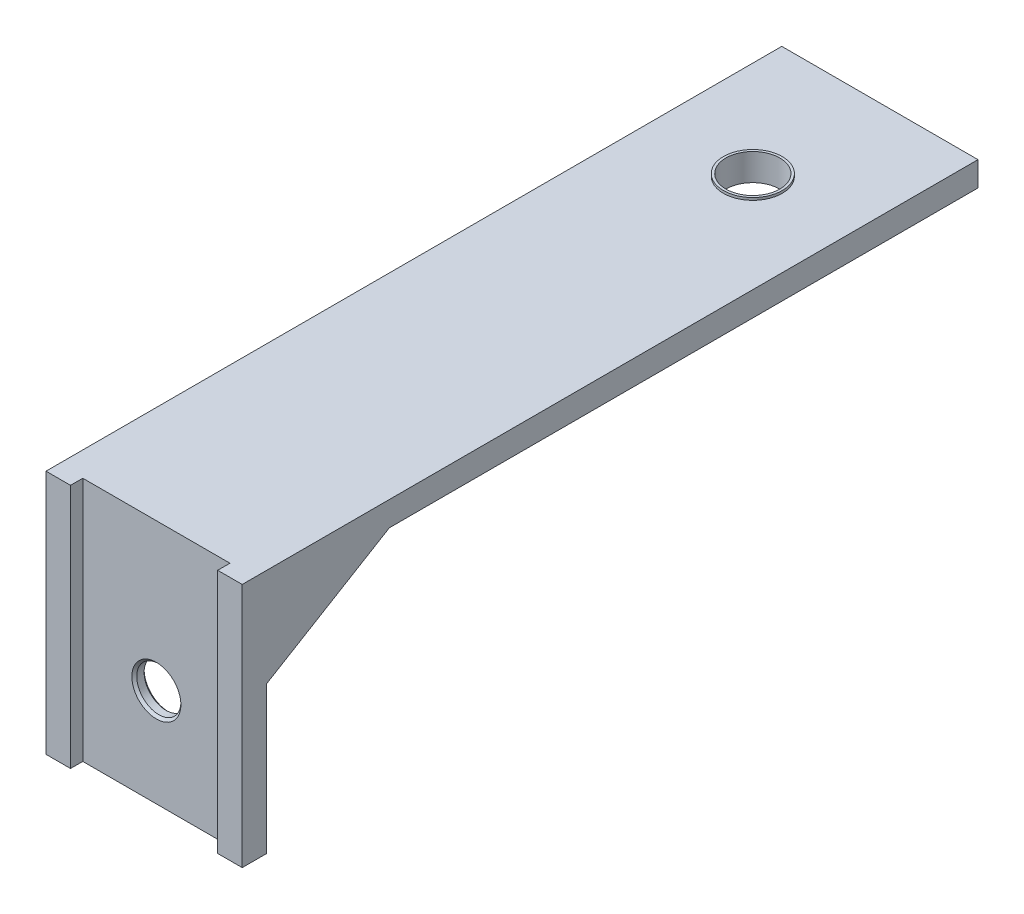
ISO-10303-21;
HEADER;
FILE_DESCRIPTION(('STEP AP214'),'2;1');
FILE_NAME('part.step','',(''),(''),'','','');
FILE_SCHEMA(('AUTOMOTIVE_DESIGN { 1 0 10303 214 1 1 1 1 }'));
ENDSEC;
DATA;
#1=APPLICATION_CONTEXT('core data for automotive mechanical design processes');
#2=APPLICATION_PROTOCOL_DEFINITION('international standard','automotive_design',2000,#1);
#3=PRODUCT_CONTEXT('',#1,'mechanical');
#4=PRODUCT('Part','Part','',(#3));
#5=PRODUCT_RELATED_PRODUCT_CATEGORY('part','',(#4));
#6=PRODUCT_DEFINITION_FORMATION('','',#4);
#7=PRODUCT_DEFINITION_CONTEXT('part definition',#1,'design');
#8=PRODUCT_DEFINITION('design','',#6,#7);
#9=PRODUCT_DEFINITION_SHAPE('','',#8);
#10=(LENGTH_UNIT() NAMED_UNIT(*) SI_UNIT(.MILLI.,.METRE.));
#11=(NAMED_UNIT(*) PLANE_ANGLE_UNIT() SI_UNIT($,.RADIAN.));
#12=(NAMED_UNIT(*) SI_UNIT($,.STERADIAN.) SOLID_ANGLE_UNIT());
#13=UNCERTAINTY_MEASURE_WITH_UNIT(LENGTH_MEASURE(1.E-05),#10,'distance_accuracy_value','');
#14=(GEOMETRIC_REPRESENTATION_CONTEXT(3) GLOBAL_UNCERTAINTY_ASSIGNED_CONTEXT((#13)) GLOBAL_UNIT_ASSIGNED_CONTEXT((#10,
#11,#12)) REPRESENTATION_CONTEXT('',''));
#15=CARTESIAN_POINT('',(0.,0.,0.));
#16=DIRECTION('',(0.,0.,1.));
#17=DIRECTION('',(1.,0.,0.));
#18=AXIS2_PLACEMENT_3D('',#15,#16,#17);
#19=CARTESIAN_POINT('',(40.,50.,0.));
#20=DIRECTION('',(0.,1.,0.));
#21=DIRECTION('',(0.,0.,1.));
#22=AXIS2_PLACEMENT_3D('',#19,#20,#21);
#23=PLANE('',#22);
#24=DIRECTION('',(-1.,0.,0.));
#25=VECTOR('',#24,1.);
#26=CARTESIAN_POINT('',(40.,50.,-150.));
#27=LINE('',#26,#25);
#28=CARTESIAN_POINT('',(40.,50.,-150.));
#29=VERTEX_POINT('',#28);
#30=CARTESIAN_POINT('',(0.,50.,-150.));
#31=VERTEX_POINT('',#30);
#32=EDGE_CURVE('E204',#29,#31,#27,.T.);
#33=ORIENTED_EDGE('',*,*,#32,.T.);
#34=DIRECTION('',(0.,0.,-1.));
#35=VECTOR('',#34,1.);
#36=CARTESIAN_POINT('',(0.,50.,0.));
#37=LINE('',#36,#35);
#38=CARTESIAN_POINT('',(0.,50.,0.));
#39=VERTEX_POINT('',#38);
#40=EDGE_CURVE('E179',#39,#31,#37,.T.);
#41=ORIENTED_EDGE('',*,*,#40,.F.);
#42=DIRECTION('',(-1.,0.,0.));
#43=VECTOR('',#42,1.);
#44=CARTESIAN_POINT('',(40.,50.,0.));
#45=LINE('',#44,#43);
#46=CARTESIAN_POINT('',(5.,50.,0.));
#47=VERTEX_POINT('',#46);
#48=EDGE_CURVE('E170',#47,#39,#45,.T.);
#49=ORIENTED_EDGE('',*,*,#48,.F.);
#50=DIRECTION('',(0.,0.,1.));
#51=VECTOR('',#50,1.);
#52=CARTESIAN_POINT('',(5.,50.,-2.5));
#53=LINE('',#52,#51);
#54=CARTESIAN_POINT('',(5.,50.,-2.5));
#55=VERTEX_POINT('',#54);
#56=EDGE_CURVE('E242',#55,#47,#53,.T.);
#57=ORIENTED_EDGE('',*,*,#56,.F.);
#58=DIRECTION('',(-1.,0.,0.));
#59=VECTOR('',#58,1.);
#60=CARTESIAN_POINT('',(35.,50.,-2.5));
#61=LINE('',#60,#59);
#62=CARTESIAN_POINT('',(35.,50.,-2.5));
#63=VERTEX_POINT('',#62);
#64=EDGE_CURVE('E234',#63,#55,#61,.T.);
#65=ORIENTED_EDGE('',*,*,#64,.F.);
#66=DIRECTION('',(0.,0.,-1.));
#67=VECTOR('',#66,1.);
#68=CARTESIAN_POINT('',(35.,50.,-2.5));
#69=LINE('',#68,#67);
#70=CARTESIAN_POINT('',(35.,50.,0.));
#71=VERTEX_POINT('',#70);
#72=EDGE_CURVE('E243',#71,#63,#69,.T.);
#73=ORIENTED_EDGE('',*,*,#72,.F.);
#74=CARTESIAN_POINT('',(40.,50.,0.));
#75=VERTEX_POINT('',#74);
#76=EDGE_CURVE('E207',#75,#71,#45,.T.);
#77=ORIENTED_EDGE('',*,*,#76,.F.);
#78=DIRECTION('',(0.,0.,-1.));
#79=VECTOR('',#78,1.);
#80=CARTESIAN_POINT('',(40.,50.,0.));
#81=LINE('',#80,#79);
#82=EDGE_CURVE('E265',#75,#29,#81,.T.);
#83=ORIENTED_EDGE('',*,*,#82,.T.);
#84=EDGE_LOOP('',(#33,#41,#49,#57,#65,#73,#77,#83));
#85=FACE_BOUND('',#84,.T.);
#86=CARTESIAN_POINT('',(20.,50.,-124.097336258444));
#87=DIRECTION('',(0.,1.,0.));
#88=DIRECTION('',(0.,0.,1.));
#89=AXIS2_PLACEMENT_3D('',#86,#87,#88);
#90=CIRCLE('',#89,6.);
#91=CARTESIAN_POINT('',(20.,50.,-118.097336258444));
#92=VERTEX_POINT('',#91);
#93=EDGE_CURVE('E359',#92,#92,#90,.T.);
#94=ORIENTED_EDGE('',*,*,#93,.F.);
#95=EDGE_LOOP('',(#94));
#96=FACE_BOUND('',#95,.T.);
#97=ADVANCED_FACE('F41',(#85,#96),#23,.T.);
#98=CARTESIAN_POINT('',(40.,0.,0.));
#99=DIRECTION('',(0.,0.,1.));
#100=DIRECTION('',(1.,0.,0.));
#101=AXIS2_PLACEMENT_3D('',#98,#99,#100);
#102=PLANE('',#101);
#103=DIRECTION('',(0.,1.,0.));
#104=VECTOR('',#103,1.);
#105=CARTESIAN_POINT('',(35.,0.,0.));
#106=LINE('',#105,#104);
#107=CARTESIAN_POINT('',(35.,0.,0.));
#108=VERTEX_POINT('',#107);
#109=EDGE_CURVE('E180',#108,#71,#106,.T.);
#110=ORIENTED_EDGE('',*,*,#109,.F.);
#111=DIRECTION('',(-1.,0.,0.));
#112=VECTOR('',#111,1.);
#113=CARTESIAN_POINT('',(40.,0.,0.));
#114=LINE('',#113,#112);
#115=CARTESIAN_POINT('',(40.,0.,0.));
#116=VERTEX_POINT('',#115);
#117=EDGE_CURVE('E192',#116,#108,#114,.T.);
#118=ORIENTED_EDGE('',*,*,#117,.F.);
#119=DIRECTION('',(0.,1.,0.));
#120=VECTOR('',#119,1.);
#121=CARTESIAN_POINT('',(40.,0.,0.));
#122=LINE('',#121,#120);
#123=EDGE_CURVE('E191',#116,#75,#122,.T.);
#124=ORIENTED_EDGE('',*,*,#123,.T.);
#125=ORIENTED_EDGE('',*,*,#76,.T.);
#126=EDGE_LOOP('',(#110,#118,#124,#125));
#127=FACE_BOUND('',#126,.T.);
#128=ADVANCED_FACE('F310',(#127),#102,.T.);
#129=DIRECTION('',(0.,1.,0.));
#130=VECTOR('',#129,1.);
#131=CARTESIAN_POINT('',(5.,0.,0.));
#132=LINE('',#131,#130);
#133=CARTESIAN_POINT('',(5.,0.,0.));
#134=VERTEX_POINT('',#133);
#135=EDGE_CURVE('E258',#134,#47,#132,.T.);
#136=ORIENTED_EDGE('',*,*,#135,.T.);
#137=ORIENTED_EDGE('',*,*,#48,.T.);
#138=DIRECTION('',(0.,1.,0.));
#139=VECTOR('',#138,1.);
#140=CARTESIAN_POINT('',(0.,0.,0.));
#141=LINE('',#140,#139);
#142=CARTESIAN_POINT('',(0.,0.,0.));
#143=VERTEX_POINT('',#142);
#144=EDGE_CURVE('E176',#143,#39,#141,.T.);
#145=ORIENTED_EDGE('',*,*,#144,.F.);
#146=EDGE_CURVE('E196',#134,#143,#114,.T.);
#147=ORIENTED_EDGE('',*,*,#146,.F.);
#148=EDGE_LOOP('',(#136,#137,#145,#147));
#149=FACE_BOUND('',#148,.T.);
#150=ADVANCED_FACE('F317',(#149),#102,.T.);
#151=CARTESIAN_POINT('',(40.,0.,0.));
#152=DIRECTION('',(0.,1.,0.));
#153=DIRECTION('',(0.,0.,1.));
#154=AXIS2_PLACEMENT_3D('',#151,#152,#153);
#155=PLANE('',#154);
#156=ORIENTED_EDGE('',*,*,#117,.T.);
#157=DIRECTION('',(0.,0.,-1.));
#158=VECTOR('',#157,1.);
#159=CARTESIAN_POINT('',(35.,0.,-2.5));
#160=LINE('',#159,#158);
#161=CARTESIAN_POINT('',(35.,0.,-2.5));
#162=VERTEX_POINT('',#161);
#163=EDGE_CURVE('E250',#108,#162,#160,.T.);
#164=ORIENTED_EDGE('',*,*,#163,.T.);
#165=DIRECTION('',(-1.,0.,0.));
#166=VECTOR('',#165,1.);
#167=CARTESIAN_POINT('',(35.,0.,-2.5));
#168=LINE('',#167,#166);
#169=CARTESIAN_POINT('',(5.,0.,-2.5));
#170=VERTEX_POINT('',#169);
#171=EDGE_CURVE('E253',#162,#170,#168,.T.);
#172=ORIENTED_EDGE('',*,*,#171,.T.);
#173=DIRECTION('',(0.,0.,1.));
#174=VECTOR('',#173,1.);
#175=CARTESIAN_POINT('',(5.,0.,-2.5));
#176=LINE('',#175,#174);
#177=EDGE_CURVE('E262',#170,#134,#176,.T.);
#178=ORIENTED_EDGE('',*,*,#177,.T.);
#179=ORIENTED_EDGE('',*,*,#146,.T.);
#180=DIRECTION('',(0.,0.,-1.));
#181=VECTOR('',#180,1.);
#182=CARTESIAN_POINT('',(0.,0.,0.));
#183=LINE('',#182,#181);
#184=CARTESIAN_POINT('',(0.,0.,-5.));
#185=VERTEX_POINT('',#184);
#186=EDGE_CURVE('E189',#143,#185,#183,.T.);
#187=ORIENTED_EDGE('',*,*,#186,.T.);
#188=DIRECTION('',(-1.,0.,0.));
#189=VECTOR('',#188,1.);
#190=CARTESIAN_POINT('',(40.,0.,-5.));
#191=LINE('',#190,#189);
#192=CARTESIAN_POINT('',(40.,0.,-5.));
#193=VERTEX_POINT('',#192);
#194=EDGE_CURVE('E197',#193,#185,#191,.T.);
#195=ORIENTED_EDGE('',*,*,#194,.F.);
#196=DIRECTION('',(0.,0.,-1.));
#197=VECTOR('',#196,1.);
#198=CARTESIAN_POINT('',(40.,0.,0.));
#199=LINE('',#198,#197);
#200=EDGE_CURVE('E166',#116,#193,#199,.T.);
#201=ORIENTED_EDGE('',*,*,#200,.F.);
#202=EDGE_LOOP('',(#156,#164,#172,#178,#179,#187,#195,#201));
#203=FACE_BOUND('',#202,.T.);
#204=ADVANCED_FACE('F312',(#203),#155,.F.);
#205=CARTESIAN_POINT('',(40.,0.,-5.));
#206=DIRECTION('',(0.,0.,1.));
#207=DIRECTION('',(1.,0.,0.));
#208=AXIS2_PLACEMENT_3D('',#205,#206,#207);
#209=PLANE('',#208);
#210=CARTESIAN_POINT('',(20.,20.,-5.));
#211=DIRECTION('',(0.,0.,1.));
#212=DIRECTION('',(1.,0.,0.));
#213=AXIS2_PLACEMENT_3D('',#210,#211,#212);
#214=CIRCLE('',#213,5.00000000000002);
#215=CARTESIAN_POINT('',(15.,20.,-5.));
#216=VERTEX_POINT('',#215);
#217=EDGE_CURVE('E11',#216,#216,#214,.T.);
#218=ORIENTED_EDGE('',*,*,#217,.T.);
#219=EDGE_LOOP('',(#218));
#220=FACE_BOUND('',#219,.T.);
#221=DIRECTION('',(0.,1.,0.));
#222=VECTOR('',#221,1.);
#223=CARTESIAN_POINT('',(0.,0.,-5.));
#224=LINE('',#223,#222);
#225=CARTESIAN_POINT('',(0.,30.,-5.));
#226=VERTEX_POINT('',#225);
#227=EDGE_CURVE('E187',#185,#226,#224,.T.);
#228=ORIENTED_EDGE('',*,*,#227,.T.);
#229=DIRECTION('',(-1.,0.,0.));
#230=VECTOR('',#229,1.);
#231=CARTESIAN_POINT('',(0.,30.,-5.));
#232=LINE('',#231,#230);
#233=CARTESIAN_POINT('',(5.,30.,-5.));
#234=VERTEX_POINT('',#233);
#235=EDGE_CURVE('E56',#234,#226,#232,.T.);
#236=ORIENTED_EDGE('',*,*,#235,.F.);
#237=DIRECTION('',(0.,1.,0.));
#238=VECTOR('',#237,1.);
#239=CARTESIAN_POINT('',(5.,25.,-5.));
#240=LINE('',#239,#238);
#241=CARTESIAN_POINT('',(5.,45.,-5.));
#242=VERTEX_POINT('',#241);
#243=EDGE_CURVE('E289',#234,#242,#240,.T.);
#244=ORIENTED_EDGE('',*,*,#243,.T.);
#245=DIRECTION('',(-1.,0.,0.));
#246=VECTOR('',#245,1.);
#247=CARTESIAN_POINT('',(40.,45.,-5.));
#248=LINE('',#247,#246);
#249=CARTESIAN_POINT('',(35.,45.,-5.));
#250=VERTEX_POINT('',#249);
#251=EDGE_CURVE('E199',#250,#242,#248,.T.);
#252=ORIENTED_EDGE('',*,*,#251,.F.);
#253=DIRECTION('',(0.,1.,0.));
#254=VECTOR('',#253,1.);
#255=CARTESIAN_POINT('',(35.,25.,-5.));
#256=LINE('',#255,#254);
#257=CARTESIAN_POINT('',(35.,30.,-5.));
#258=VERTEX_POINT('',#257);
#259=EDGE_CURVE('E161',#258,#250,#256,.T.);
#260=ORIENTED_EDGE('',*,*,#259,.F.);
#261=DIRECTION('',(1.,0.,0.));
#262=VECTOR('',#261,1.);
#263=CARTESIAN_POINT('',(40.,30.,-5.));
#264=LINE('',#263,#262);
#265=CARTESIAN_POINT('',(40.,30.,-5.));
#266=VERTEX_POINT('',#265);
#267=EDGE_CURVE('E147',#258,#266,#264,.T.);
#268=ORIENTED_EDGE('',*,*,#267,.T.);
#269=DIRECTION('',(0.,1.,0.));
#270=VECTOR('',#269,1.);
#271=CARTESIAN_POINT('',(40.,0.,-5.));
#272=LINE('',#271,#270);
#273=EDGE_CURVE('E159',#193,#266,#272,.T.);
#274=ORIENTED_EDGE('',*,*,#273,.F.);
#275=ORIENTED_EDGE('',*,*,#194,.T.);
#276=EDGE_LOOP('',(#228,#236,#244,#252,#260,#268,#274,#275));
#277=FACE_BOUND('',#276,.T.);
#278=ADVANCED_FACE('F157',(#220,#277),#209,.F.);
#279=CARTESIAN_POINT('',(40.,45.,-5.));
#280=DIRECTION('',(0.,1.,0.));
#281=DIRECTION('',(0.,0.,1.));
#282=AXIS2_PLACEMENT_3D('',#279,#280,#281);
#283=PLANE('',#282);
#284=CARTESIAN_POINT('',(20.,45.,-124.097336258444));
#285=DIRECTION('',(0.,1.,0.));
#286=DIRECTION('',(0.,0.,1.));
#287=AXIS2_PLACEMENT_3D('',#284,#285,#286);
#288=CIRCLE('',#287,5.5);
#289=CARTESIAN_POINT('',(20.,45.,-118.597336258444));
#290=VERTEX_POINT('',#289);
#291=EDGE_CURVE('E293',#290,#290,#288,.T.);
#292=ORIENTED_EDGE('',*,*,#291,.T.);
#293=EDGE_LOOP('',(#292));
#294=FACE_BOUND('',#293,.T.);
#295=DIRECTION('',(0.,0.,1.));
#296=VECTOR('',#295,1.);
#297=CARTESIAN_POINT('',(5.,45.,-5.));
#298=LINE('',#297,#296);
#299=CARTESIAN_POINT('',(5.,45.,-30.));
#300=VERTEX_POINT('',#299);
#301=EDGE_CURVE('E64',#300,#242,#298,.T.);
#302=ORIENTED_EDGE('',*,*,#301,.F.);
#303=DIRECTION('',(-1.,0.,0.));
#304=VECTOR('',#303,1.);
#305=CARTESIAN_POINT('',(40.,45.,-30.));
#306=LINE('',#305,#304);
#307=CARTESIAN_POINT('',(0.,45.,-30.));
#308=VERTEX_POINT('',#307);
#309=EDGE_CURVE('E276',#300,#308,#306,.T.);
#310=ORIENTED_EDGE('',*,*,#309,.T.);
#311=DIRECTION('',(0.,0.,-1.));
#312=VECTOR('',#311,1.);
#313=CARTESIAN_POINT('',(0.,45.,-5.));
#314=LINE('',#313,#312);
#315=CARTESIAN_POINT('',(0.,45.,-150.));
#316=VERTEX_POINT('',#315);
#317=EDGE_CURVE('E185',#308,#316,#314,.T.);
#318=ORIENTED_EDGE('',*,*,#317,.T.);
#319=DIRECTION('',(-1.,0.,0.));
#320=VECTOR('',#319,1.);
#321=CARTESIAN_POINT('',(40.,45.,-150.));
#322=LINE('',#321,#320);
#323=CARTESIAN_POINT('',(40.,45.,-150.));
#324=VERTEX_POINT('',#323);
#325=EDGE_CURVE('E201',#324,#316,#322,.T.);
#326=ORIENTED_EDGE('',*,*,#325,.F.);
#327=DIRECTION('',(0.,0.,-1.));
#328=VECTOR('',#327,1.);
#329=CARTESIAN_POINT('',(40.,45.,-5.));
#330=LINE('',#329,#328);
#331=CARTESIAN_POINT('',(40.,45.,-30.));
#332=VERTEX_POINT('',#331);
#333=EDGE_CURVE('E168',#332,#324,#330,.T.);
#334=ORIENTED_EDGE('',*,*,#333,.F.);
#335=DIRECTION('',(1.,0.,0.));
#336=VECTOR('',#335,1.);
#337=CARTESIAN_POINT('',(40.,45.,-30.));
#338=LINE('',#337,#336);
#339=CARTESIAN_POINT('',(35.,45.,-30.));
#340=VERTEX_POINT('',#339);
#341=EDGE_CURVE('E150',#332,#340,#338,.F.);
#342=ORIENTED_EDGE('',*,*,#341,.T.);
#343=DIRECTION('',(0.,0.,-1.));
#344=VECTOR('',#343,1.);
#345=CARTESIAN_POINT('',(35.,45.,-5.));
#346=LINE('',#345,#344);
#347=EDGE_CURVE('E301',#250,#340,#346,.T.);
#348=ORIENTED_EDGE('',*,*,#347,.F.);
#349=ORIENTED_EDGE('',*,*,#251,.T.);
#350=EDGE_LOOP('',(#302,#310,#318,#326,#334,#342,#348,#349));
#351=FACE_BOUND('',#350,.T.);
#352=ADVANCED_FACE('F274',(#294,#351),#283,.F.);
#353=CARTESIAN_POINT('',(40.,50.,-150.));
#354=DIRECTION('',(0.,0.,-1.));
#355=DIRECTION('',(-1.,0.,0.));
#356=AXIS2_PLACEMENT_3D('',#353,#354,#355);
#357=PLANE('',#356);
#358=DIRECTION('',(0.,-1.,0.));
#359=VECTOR('',#358,1.);
#360=CARTESIAN_POINT('',(0.,50.,-150.));
#361=LINE('',#360,#359);
#362=EDGE_CURVE('E182',#31,#316,#361,.T.);
#363=ORIENTED_EDGE('',*,*,#362,.F.);
#364=ORIENTED_EDGE('',*,*,#32,.F.);
#365=DIRECTION('',(0.,-1.,0.));
#366=VECTOR('',#365,1.);
#367=CARTESIAN_POINT('',(40.,50.,-150.));
#368=LINE('',#367,#366);
#369=EDGE_CURVE('E172',#29,#324,#368,.T.);
#370=ORIENTED_EDGE('',*,*,#369,.T.);
#371=ORIENTED_EDGE('',*,*,#325,.T.);
#372=EDGE_LOOP('',(#363,#364,#370,#371));
#373=FACE_BOUND('',#372,.T.);
#374=ADVANCED_FACE('F271',(#373),#357,.T.);
#375=CARTESIAN_POINT('',(40.,0.,0.));
#376=DIRECTION('',(-1.,0.,0.));
#377=DIRECTION('',(0.,0.,1.));
#378=AXIS2_PLACEMENT_3D('',#375,#376,#377);
#379=PLANE('',#378);
#380=DIRECTION('',(0.,-0.514495755427526,0.857492925712544));
#381=VECTOR('',#380,1.);
#382=CARTESIAN_POINT('',(40.,45.,-30.));
#383=LINE('',#382,#381);
#384=EDGE_CURVE('E143',#332,#266,#383,.T.);
#385=ORIENTED_EDGE('',*,*,#384,.F.);
#386=ORIENTED_EDGE('',*,*,#333,.T.);
#387=ORIENTED_EDGE('',*,*,#369,.F.);
#388=ORIENTED_EDGE('',*,*,#82,.F.);
#389=ORIENTED_EDGE('',*,*,#123,.F.);
#390=ORIENTED_EDGE('',*,*,#200,.T.);
#391=ORIENTED_EDGE('',*,*,#273,.T.);
#392=EDGE_LOOP('',(#385,#386,#387,#388,#389,#390,#391));
#393=FACE_BOUND('',#392,.T.);
#394=ADVANCED_FACE('F163',(#393),#379,.F.);
#395=CARTESIAN_POINT('',(0.,0.,0.));
#396=DIRECTION('',(-1.,0.,0.));
#397=DIRECTION('',(0.,0.,1.));
#398=AXIS2_PLACEMENT_3D('',#395,#396,#397);
#399=PLANE('',#398);
#400=ORIENTED_EDGE('',*,*,#317,.F.);
#401=DIRECTION('',(0.,-0.514495755427526,0.857492925712544));
#402=VECTOR('',#401,1.);
#403=CARTESIAN_POINT('',(0.,45.,-30.));
#404=LINE('',#403,#402);
#405=EDGE_CURVE('E282',#308,#226,#404,.T.);
#406=ORIENTED_EDGE('',*,*,#405,.T.);
#407=ORIENTED_EDGE('',*,*,#227,.F.);
#408=ORIENTED_EDGE('',*,*,#186,.F.);
#409=ORIENTED_EDGE('',*,*,#144,.T.);
#410=ORIENTED_EDGE('',*,*,#40,.T.);
#411=ORIENTED_EDGE('',*,*,#362,.T.);
#412=EDGE_LOOP('',(#400,#406,#407,#408,#409,#410,#411));
#413=FACE_BOUND('',#412,.T.);
#414=ADVANCED_FACE('F280',(#413),#399,.T.);
#415=CARTESIAN_POINT('',(35.,0.,-2.5));
#416=DIRECTION('',(1.,0.,0.));
#417=DIRECTION('',(0.,0.,-1.));
#418=AXIS2_PLACEMENT_3D('',#415,#416,#417);
#419=PLANE('',#418);
#420=ORIENTED_EDGE('',*,*,#72,.T.);
#421=DIRECTION('',(0.,1.,0.));
#422=VECTOR('',#421,1.);
#423=CARTESIAN_POINT('',(35.,0.,-2.5));
#424=LINE('',#423,#422);
#425=EDGE_CURVE('E239',#162,#63,#424,.T.);
#426=ORIENTED_EDGE('',*,*,#425,.F.);
#427=ORIENTED_EDGE('',*,*,#163,.F.);
#428=ORIENTED_EDGE('',*,*,#109,.T.);
#429=EDGE_LOOP('',(#420,#426,#427,#428));
#430=FACE_BOUND('',#429,.T.);
#431=ADVANCED_FACE('F307',(#430),#419,.F.);
#432=CARTESIAN_POINT('',(5.,0.,-2.5));
#433=DIRECTION('',(-1.,0.,0.));
#434=DIRECTION('',(0.,0.,1.));
#435=AXIS2_PLACEMENT_3D('',#432,#433,#434);
#436=PLANE('',#435);
#437=ORIENTED_EDGE('',*,*,#56,.T.);
#438=ORIENTED_EDGE('',*,*,#135,.F.);
#439=ORIENTED_EDGE('',*,*,#177,.F.);
#440=DIRECTION('',(0.,1.,0.));
#441=VECTOR('',#440,1.);
#442=CARTESIAN_POINT('',(5.,0.,-2.5));
#443=LINE('',#442,#441);
#444=EDGE_CURVE('E237',#170,#55,#443,.T.);
#445=ORIENTED_EDGE('',*,*,#444,.T.);
#446=EDGE_LOOP('',(#437,#438,#439,#445));
#447=FACE_BOUND('',#446,.T.);
#448=ADVANCED_FACE('F229',(#447),#436,.F.);
#449=CARTESIAN_POINT('',(35.,0.,-2.5));
#450=DIRECTION('',(0.,0.,-1.));
#451=DIRECTION('',(-1.,0.,0.));
#452=AXIS2_PLACEMENT_3D('',#449,#450,#451);
#453=PLANE('',#452);
#454=CARTESIAN_POINT('',(20.,20.,-2.5));
#455=DIRECTION('',(0.,0.,-1.));
#456=DIRECTION('',(-1.,0.,0.));
#457=AXIS2_PLACEMENT_3D('',#454,#455,#456);
#458=CIRCLE('',#457,4.99999999999998);
#459=CARTESIAN_POINT('',(15.,20.,-2.5));
#460=VERTEX_POINT('',#459);
#461=EDGE_CURVE('E195',#460,#460,#458,.T.);
#462=ORIENTED_EDGE('',*,*,#461,.T.);
#463=EDGE_LOOP('',(#462));
#464=FACE_BOUND('',#463,.T.);
#465=ORIENTED_EDGE('',*,*,#64,.T.);
#466=ORIENTED_EDGE('',*,*,#444,.F.);
#467=ORIENTED_EDGE('',*,*,#171,.F.);
#468=ORIENTED_EDGE('',*,*,#425,.T.);
#469=EDGE_LOOP('',(#465,#466,#467,#468));
#470=FACE_BOUND('',#469,.T.);
#471=ADVANCED_FACE('F225',(#464,#470),#453,.F.);
#472=CARTESIAN_POINT('',(35.,25.,-75.));
#473=DIRECTION('',(1.,0.,0.));
#474=DIRECTION('',(0.,0.,-1.));
#475=AXIS2_PLACEMENT_3D('',#472,#473,#474);
#476=PLANE('',#475);
#477=ORIENTED_EDGE('',*,*,#259,.T.);
#478=ORIENTED_EDGE('',*,*,#347,.T.);
#479=DIRECTION('',(0.,-0.514495755427526,0.857492925712544));
#480=VECTOR('',#479,1.);
#481=CARTESIAN_POINT('',(35.,45.,-30.));
#482=LINE('',#481,#480);
#483=EDGE_CURVE('E154',#340,#258,#482,.T.);
#484=ORIENTED_EDGE('',*,*,#483,.T.);
#485=EDGE_LOOP('',(#477,#478,#484));
#486=FACE_BOUND('',#485,.T.);
#487=ADVANCED_FACE('F228',(#486),#476,.F.);
#488=CARTESIAN_POINT('',(40.,45.,-30.));
#489=DIRECTION('',(0.,0.857492925712544,0.514495755427526));
#490=DIRECTION('',(0.,-0.514495755427526,0.857492925712544));
#491=AXIS2_PLACEMENT_3D('',#488,#489,#490);
#492=PLANE('',#491);
#493=ORIENTED_EDGE('',*,*,#341,.F.);
#494=ORIENTED_EDGE('',*,*,#384,.T.);
#495=ORIENTED_EDGE('',*,*,#267,.F.);
#496=ORIENTED_EDGE('',*,*,#483,.F.);
#497=EDGE_LOOP('',(#493,#494,#495,#496));
#498=FACE_BOUND('',#497,.T.);
#499=ADVANCED_FACE('F145',(#498),#492,.F.);
#500=CARTESIAN_POINT('',(5.,25.,-75.));
#501=DIRECTION('',(-1.,0.,0.));
#502=DIRECTION('',(0.,0.,1.));
#503=AXIS2_PLACEMENT_3D('',#500,#501,#502);
#504=PLANE('',#503);
#505=DIRECTION('',(0.,-0.514495755427526,0.857492925712544));
#506=VECTOR('',#505,1.);
#507=CARTESIAN_POINT('',(5.,45.,-30.));
#508=LINE('',#507,#506);
#509=EDGE_CURVE('E286',#300,#234,#508,.T.);
#510=ORIENTED_EDGE('',*,*,#509,.F.);
#511=ORIENTED_EDGE('',*,*,#301,.T.);
#512=ORIENTED_EDGE('',*,*,#243,.F.);
#513=EDGE_LOOP('',(#510,#511,#512));
#514=FACE_BOUND('',#513,.T.);
#515=ADVANCED_FACE('F385',(#514),#504,.F.);
#516=CARTESIAN_POINT('',(0.,45.,-30.));
#517=DIRECTION('',(0.,-0.857492925712544,-0.514495755427526));
#518=DIRECTION('',(0.,-0.514495755427526,0.857492925712544));
#519=AXIS2_PLACEMENT_3D('',#516,#517,#518);
#520=PLANE('',#519);
#521=ORIENTED_EDGE('',*,*,#309,.F.);
#522=ORIENTED_EDGE('',*,*,#509,.T.);
#523=ORIENTED_EDGE('',*,*,#235,.T.);
#524=ORIENTED_EDGE('',*,*,#405,.F.);
#525=EDGE_LOOP('',(#521,#522,#523,#524));
#526=FACE_BOUND('',#525,.T.);
#527=ADVANCED_FACE('F284',(#526),#520,.T.);
#528=CARTESIAN_POINT('',(20.,20.,5.));
#529=DIRECTION('',(0.,0.,-1.));
#530=DIRECTION('',(-1.,0.,0.));
#531=AXIS2_PLACEMENT_3D('',#528,#529,#530);
#532=CYLINDRICAL_SURFACE('',#531,4.5);
#533=CARTESIAN_POINT('',(20.,20.,-2.99999999999998));
#534=DIRECTION('',(0.,0.,-1.));
#535=DIRECTION('',(-1.,0.,0.));
#536=AXIS2_PLACEMENT_3D('',#533,#534,#535);
#537=CIRCLE('',#536,4.5);
#538=CARTESIAN_POINT('',(15.5,20.,-2.99999999999998));
#539=VERTEX_POINT('',#538);
#540=EDGE_CURVE('E49',#539,#539,#537,.F.);
#541=ORIENTED_EDGE('',*,*,#540,.T.);
#542=EDGE_LOOP('',(#541));
#543=FACE_BOUND('',#542,.T.);
#544=CARTESIAN_POINT('',(20.,20.,-4.49999999999998));
#545=DIRECTION('',(0.,0.,1.));
#546=DIRECTION('',(1.,0.,0.));
#547=AXIS2_PLACEMENT_3D('',#544,#545,#546);
#548=CIRCLE('',#547,4.5);
#549=CARTESIAN_POINT('',(15.5,20.,-4.49999999999998));
#550=VERTEX_POINT('',#549);
#551=EDGE_CURVE('E212',#550,#550,#548,.F.);
#552=ORIENTED_EDGE('',*,*,#551,.T.);
#553=EDGE_LOOP('',(#552));
#554=FACE_BOUND('',#553,.T.);
#555=ADVANCED_FACE('F217',(#543,#554),#532,.F.);
#556=CARTESIAN_POINT('',(20.,20.,-2.5));
#557=DIRECTION('',(0.,0.,1.));
#558=DIRECTION('',(1.,0.,0.));
#559=AXIS2_PLACEMENT_3D('',#556,#557,#558);
#560=CONICAL_SURFACE('',#559,4.99999999999998,0.785398163397441);
#561=ORIENTED_EDGE('',*,*,#540,.F.);
#562=EDGE_LOOP('',(#561));
#563=FACE_BOUND('',#562,.T.);
#564=ORIENTED_EDGE('',*,*,#461,.F.);
#565=EDGE_LOOP('',(#564));
#566=FACE_BOUND('',#565,.T.);
#567=ADVANCED_FACE('F220',(#563,#566),#560,.F.);
#568=CARTESIAN_POINT('',(20.,20.,-4.49999999999998));
#569=DIRECTION('',(0.,0.,-1.));
#570=DIRECTION('',(-1.,0.,0.));
#571=AXIS2_PLACEMENT_3D('',#568,#569,#570);
#572=CONICAL_SURFACE('',#571,4.5,0.785398163397446);
#573=CARTESIAN_POINT('',(15.,20.,-5.));
#574=CARTESIAN_POINT('',(15.0052083333333,20.,-4.99479166666667));
#575=CARTESIAN_POINT('',(15.0104166666666,20.,-4.98958333333333));
#576=CARTESIAN_POINT('',(15.0208333333333,20.,-4.97916666666667));
#577=CARTESIAN_POINT('',(15.0260416666666,20.,-4.97395833333333));
#578=CARTESIAN_POINT('',(15.0364583333333,20.,-4.96354166666667));
#579=CARTESIAN_POINT('',(15.0416666666666,20.,-4.95833333333333));
#580=CARTESIAN_POINT('',(15.0520833333333,20.,-4.94791666666666));
#581=CARTESIAN_POINT('',(15.0572916666666,20.,-4.94270833333333));
#582=CARTESIAN_POINT('',(15.0677083333333,20.,-4.93229166666666));
#583=CARTESIAN_POINT('',(15.0729166666666,20.,-4.92708333333333));
#584=CARTESIAN_POINT('',(15.0833333333333,20.,-4.91666666666666));
#585=CARTESIAN_POINT('',(15.0885416666666,20.,-4.91145833333333));
#586=CARTESIAN_POINT('',(15.0989583333333,20.,-4.90104166666666));
#587=CARTESIAN_POINT('',(15.1041666666667,20.,-4.89583333333333));
#588=CARTESIAN_POINT('',(15.1145833333333,20.,-4.88541666666666));
#589=CARTESIAN_POINT('',(15.1197916666667,20.,-4.88020833333333));
#590=CARTESIAN_POINT('',(15.1302083333333,20.,-4.86979166666666));
#591=CARTESIAN_POINT('',(15.1354166666667,20.,-4.86458333333333));
#592=CARTESIAN_POINT('',(15.1458333333333,20.,-4.85416666666666));
#593=CARTESIAN_POINT('',(15.1510416666667,20.,-4.84895833333333));
#594=CARTESIAN_POINT('',(15.1614583333333,20.,-4.83854166666666));
#595=CARTESIAN_POINT('',(15.1666666666667,20.,-4.83333333333333));
#596=CARTESIAN_POINT('',(15.1770833333333,20.,-4.82291666666666));
#597=CARTESIAN_POINT('',(15.1822916666667,20.,-4.81770833333333));
#598=CARTESIAN_POINT('',(15.1927083333333,20.,-4.80729166666666));
#599=CARTESIAN_POINT('',(15.1979166666667,20.,-4.80208333333333));
#600=CARTESIAN_POINT('',(15.2083333333333,20.,-4.79166666666666));
#601=CARTESIAN_POINT('',(15.2135416666667,20.,-4.78645833333333));
#602=CARTESIAN_POINT('',(15.2239583333333,20.,-4.77604166666666));
#603=CARTESIAN_POINT('',(15.2291666666667,20.,-4.77083333333333));
#604=CARTESIAN_POINT('',(15.2395833333333,20.,-4.76041666666666));
#605=CARTESIAN_POINT('',(15.2447916666667,20.,-4.75520833333332));
#606=CARTESIAN_POINT('',(15.2552083333333,20.,-4.74479166666666));
#607=CARTESIAN_POINT('',(15.2604166666667,20.,-4.73958333333332));
#608=CARTESIAN_POINT('',(15.2708333333333,20.,-4.72916666666666));
#609=CARTESIAN_POINT('',(15.2760416666667,20.,-4.72395833333332));
#610=CARTESIAN_POINT('',(15.2864583333333,20.,-4.71354166666666));
#611=CARTESIAN_POINT('',(15.2916666666667,20.,-4.70833333333332));
#612=CARTESIAN_POINT('',(15.3020833333333,20.,-4.69791666666665));
#613=CARTESIAN_POINT('',(15.3072916666667,20.,-4.69270833333332));
#614=CARTESIAN_POINT('',(15.3177083333333,20.,-4.68229166666665));
#615=CARTESIAN_POINT('',(15.3229166666667,20.,-4.67708333333332));
#616=CARTESIAN_POINT('',(15.3333333333333,20.,-4.66666666666665));
#617=CARTESIAN_POINT('',(15.3385416666667,20.,-4.66145833333332));
#618=CARTESIAN_POINT('',(15.3489583333333,20.,-4.65104166666665));
#619=CARTESIAN_POINT('',(15.3541666666667,20.,-4.64583333333332));
#620=CARTESIAN_POINT('',(15.3645833333333,20.,-4.63541666666665));
#621=CARTESIAN_POINT('',(15.3697916666667,20.,-4.63020833333332));
#622=CARTESIAN_POINT('',(15.3802083333333,20.,-4.61979166666665));
#623=CARTESIAN_POINT('',(15.3854166666667,20.,-4.61458333333332));
#624=CARTESIAN_POINT('',(15.3958333333333,20.,-4.60416666666665));
#625=CARTESIAN_POINT('',(15.4010416666667,20.,-4.59895833333332));
#626=CARTESIAN_POINT('',(15.4114583333333,20.,-4.58854166666665));
#627=CARTESIAN_POINT('',(15.4166666666667,20.,-4.58333333333332));
#628=CARTESIAN_POINT('',(15.4270833333333,20.,-4.57291666666665));
#629=CARTESIAN_POINT('',(15.4322916666667,20.,-4.56770833333332));
#630=CARTESIAN_POINT('',(15.4427083333333,20.,-4.55729166666665));
#631=CARTESIAN_POINT('',(15.4479166666667,20.,-4.55208333333332));
#632=CARTESIAN_POINT('',(15.4583333333333,20.,-4.54166666666665));
#633=CARTESIAN_POINT('',(15.4635416666667,20.,-4.53645833333332));
#634=CARTESIAN_POINT('',(15.4739583333333,20.,-4.52604166666665));
#635=CARTESIAN_POINT('',(15.4791666666667,20.,-4.52083333333332));
#636=CARTESIAN_POINT('',(15.4895833333333,20.,-4.51041666666665));
#637=CARTESIAN_POINT('',(15.4947916666667,20.,-4.50520833333331));
#638=CARTESIAN_POINT('',(15.5,20.,-4.49999999999998));
#639=B_SPLINE_CURVE_WITH_KNOTS('',3,(#573,#574,#575,#576,#577,#578,#579,#580,#581,#582,#583,
#584,#585,#586,#587,#588,#589,#590,#591,#592,#593,#594,#595,#596,#597,#598,#599,#600,#601,#602,
#603,#604,#605,#606,#607,#608,#609,#610,#611,#612,#613,#614,#615,#616,#617,#618,#619,#620,#621,
#622,#623,#624,#625,#626,#627,#628,#629,#630,#631,#632,#633,#634,#635,#636,#637,#638),
.UNSPECIFIED.,.F.,.F.,(4,2,2,2,2,2,2,2,2,2,2,2,2,2,2,2,2,2,2,2,2,2,2,2,2,2,2,2,2,2,2,2,4),(0.,
0.0220970869120796,0.0441941738241599,0.0662912607362414,0.088388347648321,0.110485434560401,
0.132582521472483,0.154679608384562,0.176776695296643,0.198873782208724,0.220970869120802,
0.243067956032884,0.265165042944965,0.287262129857044,0.309359216769125,0.331456303681205,
0.353553390593286,0.375650477505367,0.397747564417447,0.419844651329527,0.441941738241608,
0.464038825153688,0.486135912065768,0.508232998977849,0.530330085889929,0.55242717280201,
0.574524259714091,0.596621346626171,0.618718433538251,0.640815520450332,0.662912607362411,
0.685009694274492,0.707106781186574),.UNSPECIFIED.);
#640=EDGE_CURVE('BSEAM43',#216,#550,#639,.T.);
#641=ORIENTED_EDGE('',*,*,#217,.F.);
#642=ORIENTED_EDGE('',*,*,#551,.F.);
#643=ORIENTED_EDGE('',*,*,#640,.T.);
#644=ORIENTED_EDGE('',*,*,#640,.F.);
#645=EDGE_LOOP('',(#641,#643,#642,#644));
#646=FACE_BOUND('',#645,.T.);
#647=ADVANCED_FACE('F43',(#646),#572,.F.);
#648=CARTESIAN_POINT('',(20.,40.,-124.097336258444));
#649=DIRECTION('',(0.,1.,0.));
#650=DIRECTION('',(0.,0.,1.));
#651=AXIS2_PLACEMENT_3D('',#648,#649,#650);
#652=CYLINDRICAL_SURFACE('',#651,5.5);
#653=ORIENTED_EDGE('',*,*,#291,.F.);
#654=EDGE_LOOP('',(#653));
#655=FACE_BOUND('',#654,.T.);
#656=CARTESIAN_POINT('',(20.,50.5,-124.097336258444));
#657=DIRECTION('',(0.,1.,0.));
#658=DIRECTION('',(0.,0.,1.));
#659=AXIS2_PLACEMENT_3D('',#656,#657,#658);
#660=CIRCLE('',#659,5.50000000000001);
#661=CARTESIAN_POINT('',(20.,50.5,-118.597336258444));
#662=VERTEX_POINT('',#661);
#663=EDGE_CURVE('E364',#662,#662,#660,.T.);
#664=ORIENTED_EDGE('',*,*,#663,.T.);
#665=EDGE_LOOP('',(#664));
#666=FACE_BOUND('',#665,.T.);
#667=ADVANCED_FACE('F369',(#655,#666),#652,.F.);
#668=CARTESIAN_POINT('',(20.,50.5,-124.097336258444));
#669=DIRECTION('',(0.,1.,0.));
#670=DIRECTION('',(0.,0.,1.));
#671=AXIS2_PLACEMENT_3D('',#668,#669,#670);
#672=PLANE('',#671);
#673=CARTESIAN_POINT('',(20.,50.5,-124.097336258444));
#674=DIRECTION('',(0.,1.,0.));
#675=DIRECTION('',(0.,0.,1.));
#676=AXIS2_PLACEMENT_3D('',#673,#674,#675);
#677=CIRCLE('',#676,6.);
#678=CARTESIAN_POINT('',(20.,50.5,-118.097336258444));
#679=VERTEX_POINT('',#678);
#680=EDGE_CURVE('E357',#679,#679,#677,.T.);
#681=ORIENTED_EDGE('',*,*,#680,.T.);
#682=EDGE_LOOP('',(#681));
#683=FACE_BOUND('',#682,.T.);
#684=ORIENTED_EDGE('',*,*,#663,.F.);
#685=EDGE_LOOP('',(#684));
#686=FACE_BOUND('',#685,.T.);
#687=ADVANCED_FACE('F371',(#683,#686),#672,.T.);
#688=CARTESIAN_POINT('',(20.,50.5,-124.097336258444));
#689=DIRECTION('',(0.,-1.,0.));
#690=DIRECTION('',(0.,0.,-1.));
#691=AXIS2_PLACEMENT_3D('',#688,#689,#690);
#692=CYLINDRICAL_SURFACE('',#691,6.);
#693=ORIENTED_EDGE('',*,*,#680,.F.);
#694=EDGE_LOOP('',(#693));
#695=FACE_BOUND('',#694,.T.);
#696=ORIENTED_EDGE('',*,*,#93,.T.);
#697=EDGE_LOOP('',(#696));
#698=FACE_BOUND('',#697,.T.);
#699=ADVANCED_FACE('F373',(#695,#698),#692,.T.);
#700=CLOSED_SHELL('',(#97,#128,#150,#204,#278,#352,#374,#394,#414,#431,#448,#471,#487,#499,#515,
#527,#555,#567,#647,#667,#687,#699));
#701=MANIFOLD_SOLID_BREP('B2',#700);
#702=ADVANCED_BREP_SHAPE_REPRESENTATION('',(#18,#701),#14);
#703=SHAPE_DEFINITION_REPRESENTATION(#9,#702);
ENDSEC;
END-ISO-10303-21;
